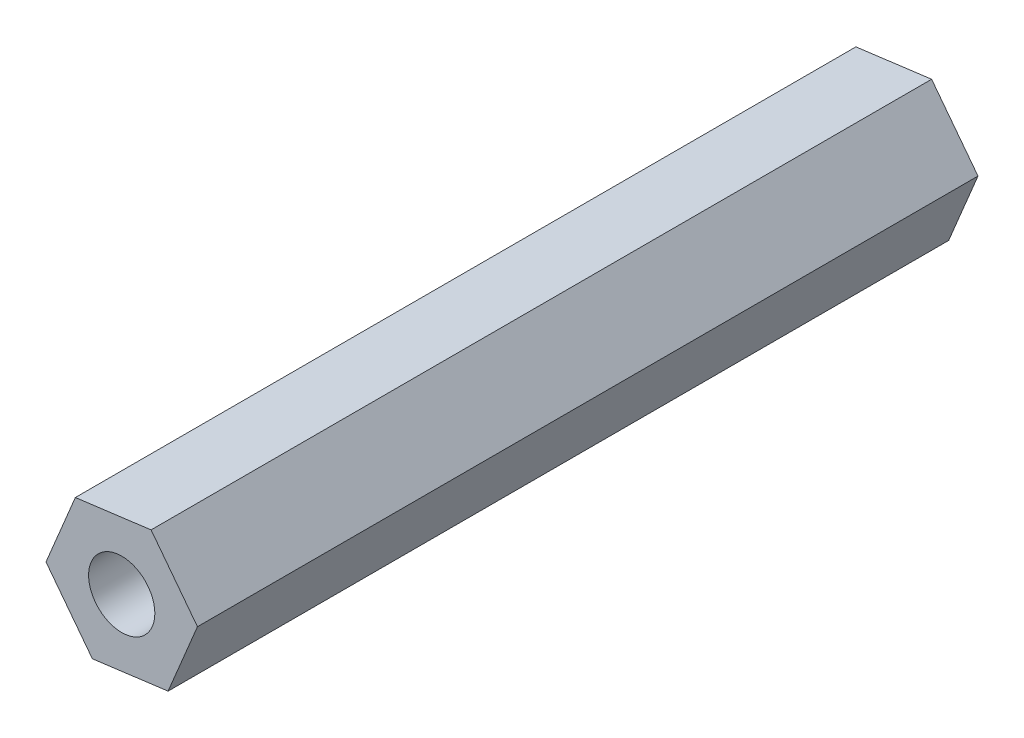
ISO-10303-21;
HEADER;
FILE_DESCRIPTION(('STEP AP214'),'2;1');
FILE_NAME('part.step','',(''),(''),'','','');
FILE_SCHEMA(('AUTOMOTIVE_DESIGN { 1 0 10303 214 1 1 1 1 }'));
ENDSEC;
DATA;
#1=APPLICATION_CONTEXT('core data for automotive mechanical design processes');
#2=APPLICATION_PROTOCOL_DEFINITION('international standard','automotive_design',2000,#1);
#3=PRODUCT_CONTEXT('',#1,'mechanical');
#4=PRODUCT('Part','Part','',(#3));
#5=PRODUCT_RELATED_PRODUCT_CATEGORY('part','',(#4));
#6=PRODUCT_DEFINITION_FORMATION('','',#4);
#7=PRODUCT_DEFINITION_CONTEXT('part definition',#1,'design');
#8=PRODUCT_DEFINITION('design','',#6,#7);
#9=PRODUCT_DEFINITION_SHAPE('','',#8);
#10=(LENGTH_UNIT() NAMED_UNIT(*) SI_UNIT(.MILLI.,.METRE.));
#11=(NAMED_UNIT(*) PLANE_ANGLE_UNIT() SI_UNIT($,.RADIAN.));
#12=(NAMED_UNIT(*) SI_UNIT($,.STERADIAN.) SOLID_ANGLE_UNIT());
#13=UNCERTAINTY_MEASURE_WITH_UNIT(LENGTH_MEASURE(1.E-05),#10,'distance_accuracy_value','');
#14=(GEOMETRIC_REPRESENTATION_CONTEXT(3) GLOBAL_UNCERTAINTY_ASSIGNED_CONTEXT((#13)) GLOBAL_UNIT_ASSIGNED_CONTEXT((#10,
#11,#12)) REPRESENTATION_CONTEXT('',''));
#15=CARTESIAN_POINT('',(0.,0.,0.));
#16=DIRECTION('',(0.,0.,1.));
#17=DIRECTION('',(1.,0.,0.));
#18=AXIS2_PLACEMENT_3D('',#15,#16,#17);
#19=CARTESIAN_POINT('',(0.,0.,74.95));
#20=DIRECTION('',(0.,0.,1.));
#21=DIRECTION('',(1.,0.,0.));
#22=AXIS2_PLACEMENT_3D('',#19,#20,#21);
#23=PLANE('',#22);
#24=DIRECTION('',(0.384520198768807,0.923116578086862,0.));
#25=VECTOR('',#24,1.);
#26=CARTESIAN_POINT('',(4.45207223514963,-5.8260094529912,74.95));
#27=LINE('',#26,#25);
#28=CARTESIAN_POINT('',(4.45207223514963,-5.8260094529912,74.95));
#29=VERTEX_POINT('',#28);
#30=CARTESIAN_POINT('',(7.27150830655346,0.942602928627349,74.95));
#31=VERTEX_POINT('',#30);
#32=EDGE_CURVE('E128',#29,#31,#27,.T.);
#33=ORIENTED_EDGE('',*,*,#32,.T.);
#34=DIRECTION('',(-0.607182307893379,0.79456254944546,0.));
#35=VECTOR('',#34,1.);
#36=CARTESIAN_POINT('',(7.27150830655346,0.942602928627349,74.95));
#37=LINE('',#36,#35);
#38=CARTESIAN_POINT('',(2.81943607140384,6.76861238161854,74.95));
#39=VERTEX_POINT('',#38);
#40=EDGE_CURVE('E86',#31,#39,#37,.T.);
#41=ORIENTED_EDGE('',*,*,#40,.T.);
#42=DIRECTION('',(-0.991702506662188,-0.1285540286414,0.));
#43=VECTOR('',#42,1.);
#44=CARTESIAN_POINT('',(2.81943607140384,6.76861238161854,74.95));
#45=LINE('',#44,#43);
#46=CARTESIAN_POINT('',(-4.45207223514962,5.8260094529912,74.95));
#47=VERTEX_POINT('',#46);
#48=EDGE_CURVE('E99',#39,#47,#45,.T.);
#49=ORIENTED_EDGE('',*,*,#48,.T.);
#50=DIRECTION('',(-0.384520198768808,-0.923116578086861,0.));
#51=VECTOR('',#50,1.);
#52=CARTESIAN_POINT('',(-4.45207223514962,5.8260094529912,74.95));
#53=LINE('',#52,#51);
#54=CARTESIAN_POINT('',(-7.27150830655346,-0.942602928627337,74.95));
#55=VERTEX_POINT('',#54);
#56=EDGE_CURVE('E93',#47,#55,#53,.T.);
#57=ORIENTED_EDGE('',*,*,#56,.T.);
#58=DIRECTION('',(0.607182307893379,-0.79456254944546,0.));
#59=VECTOR('',#58,1.);
#60=CARTESIAN_POINT('',(-7.27150830655346,-0.942602928627337,74.95));
#61=LINE('',#60,#59);
#62=CARTESIAN_POINT('',(-2.81943607140382,-6.76861238161854,74.95));
#63=VERTEX_POINT('',#62);
#64=EDGE_CURVE('E97',#55,#63,#61,.T.);
#65=ORIENTED_EDGE('',*,*,#64,.T.);
#66=DIRECTION('',(0.991702506662188,0.1285540286414,0.));
#67=VECTOR('',#66,1.);
#68=CARTESIAN_POINT('',(-2.81943607140382,-6.76861238161854,74.95));
#69=LINE('',#68,#67);
#70=EDGE_CURVE('E49',#63,#29,#69,.T.);
#71=ORIENTED_EDGE('',*,*,#70,.T.);
#72=EDGE_LOOP('',(#33,#41,#49,#57,#65,#71));
#73=FACE_BOUND('',#72,.T.);
#74=CARTESIAN_POINT('',(0.,0.,74.95));
#75=DIRECTION('',(0.,0.,1.));
#76=DIRECTION('',(1.,0.,0.));
#77=AXIS2_PLACEMENT_3D('',#74,#75,#76);
#78=CIRCLE('',#77,3.18);
#79=CARTESIAN_POINT('',(3.18,0.,74.95));
#80=VERTEX_POINT('',#79);
#81=EDGE_CURVE('E121',#80,#80,#78,.T.);
#82=ORIENTED_EDGE('',*,*,#81,.F.);
#83=EDGE_LOOP('',(#82));
#84=FACE_BOUND('',#83,.T.);
#85=ADVANCED_FACE('F32',(#73,#84),#23,.T.);
#86=CARTESIAN_POINT('',(0.,0.,0.));
#87=DIRECTION('',(0.,0.,1.));
#88=DIRECTION('',(1.,0.,0.));
#89=AXIS2_PLACEMENT_3D('',#86,#87,#88);
#90=PLANE('',#89);
#91=DIRECTION('',(0.384520198768807,0.923116578086862,0.));
#92=VECTOR('',#91,1.);
#93=CARTESIAN_POINT('',(4.45207223514963,-5.8260094529912,0.));
#94=LINE('',#93,#92);
#95=CARTESIAN_POINT('',(4.45207223514963,-5.8260094529912,0.));
#96=VERTEX_POINT('',#95);
#97=CARTESIAN_POINT('',(7.27150830655346,0.942602928627349,0.));
#98=VERTEX_POINT('',#97);
#99=EDGE_CURVE('E117',#96,#98,#94,.T.);
#100=ORIENTED_EDGE('',*,*,#99,.F.);
#101=DIRECTION('',(0.991702506662188,0.1285540286414,0.));
#102=VECTOR('',#101,1.);
#103=CARTESIAN_POINT('',(-2.81943607140382,-6.76861238161854,0.));
#104=LINE('',#103,#102);
#105=CARTESIAN_POINT('',(-2.81943607140382,-6.76861238161854,0.));
#106=VERTEX_POINT('',#105);
#107=EDGE_CURVE('E78',#106,#96,#104,.T.);
#108=ORIENTED_EDGE('',*,*,#107,.F.);
#109=DIRECTION('',(0.607182307893379,-0.79456254944546,0.));
#110=VECTOR('',#109,1.);
#111=CARTESIAN_POINT('',(-7.27150830655346,-0.942602928627337,0.));
#112=LINE('',#111,#110);
#113=CARTESIAN_POINT('',(-7.27150830655346,-0.942602928627337,0.));
#114=VERTEX_POINT('',#113);
#115=EDGE_CURVE('E72',#114,#106,#112,.T.);
#116=ORIENTED_EDGE('',*,*,#115,.F.);
#117=DIRECTION('',(-0.384520198768808,-0.923116578086861,0.));
#118=VECTOR('',#117,1.);
#119=CARTESIAN_POINT('',(-4.45207223514962,5.8260094529912,0.));
#120=LINE('',#119,#118);
#121=CARTESIAN_POINT('',(-4.45207223514962,5.8260094529912,0.));
#122=VERTEX_POINT('',#121);
#123=EDGE_CURVE('E107',#122,#114,#120,.T.);
#124=ORIENTED_EDGE('',*,*,#123,.F.);
#125=DIRECTION('',(-0.991702506662188,-0.1285540286414,0.));
#126=VECTOR('',#125,1.);
#127=CARTESIAN_POINT('',(2.81943607140384,6.76861238161854,0.));
#128=LINE('',#127,#126);
#129=CARTESIAN_POINT('',(2.81943607140384,6.76861238161854,0.));
#130=VERTEX_POINT('',#129);
#131=EDGE_CURVE('E123',#130,#122,#128,.T.);
#132=ORIENTED_EDGE('',*,*,#131,.F.);
#133=DIRECTION('',(-0.607182307893379,0.79456254944546,0.));
#134=VECTOR('',#133,1.);
#135=CARTESIAN_POINT('',(7.27150830655346,0.942602928627349,0.));
#136=LINE('',#135,#134);
#137=EDGE_CURVE('E120',#98,#130,#136,.T.);
#138=ORIENTED_EDGE('',*,*,#137,.F.);
#139=EDGE_LOOP('',(#100,#108,#116,#124,#132,#138));
#140=FACE_BOUND('',#139,.T.);
#141=CARTESIAN_POINT('',(0.,0.,0.));
#142=DIRECTION('',(0.,0.,1.));
#143=DIRECTION('',(1.,0.,0.));
#144=AXIS2_PLACEMENT_3D('',#141,#142,#143);
#145=CIRCLE('',#144,3.18);
#146=CARTESIAN_POINT('',(3.18,0.,0.));
#147=VERTEX_POINT('',#146);
#148=EDGE_CURVE('E221',#147,#147,#145,.T.);
#149=ORIENTED_EDGE('',*,*,#148,.T.);
#150=EDGE_LOOP('',(#149));
#151=FACE_BOUND('',#150,.T.);
#152=ADVANCED_FACE('F137',(#140,#151),#90,.F.);
#153=CARTESIAN_POINT('',(4.45207223514963,-5.8260094529912,74.95));
#154=DIRECTION('',(-0.923116578086862,0.384520198768807,0.));
#155=DIRECTION('',(-0.384520198768807,-0.923116578086862,0.));
#156=AXIS2_PLACEMENT_3D('',#153,#154,#155);
#157=PLANE('',#156);
#158=ORIENTED_EDGE('',*,*,#99,.T.);
#159=DIRECTION('',(0.,0.,-1.));
#160=VECTOR('',#159,1.);
#161=CARTESIAN_POINT('',(7.27150830655346,0.942602928627349,74.95));
#162=LINE('',#161,#160);
#163=EDGE_CURVE('E11',#31,#98,#162,.T.);
#164=ORIENTED_EDGE('',*,*,#163,.F.);
#165=ORIENTED_EDGE('',*,*,#32,.F.);
#166=DIRECTION('',(0.,0.,-1.));
#167=VECTOR('',#166,1.);
#168=CARTESIAN_POINT('',(4.45207223514963,-5.8260094529912,74.95));
#169=LINE('',#168,#167);
#170=EDGE_CURVE('E113',#29,#96,#169,.T.);
#171=ORIENTED_EDGE('',*,*,#170,.T.);
#172=EDGE_LOOP('',(#158,#164,#165,#171));
#173=FACE_BOUND('',#172,.T.);
#174=ADVANCED_FACE('F34',(#173),#157,.F.);
#175=CARTESIAN_POINT('',(7.27150830655346,0.942602928627349,74.95));
#176=DIRECTION('',(-0.79456254944546,-0.607182307893379,0.));
#177=DIRECTION('',(0.607182307893379,-0.79456254944546,0.));
#178=AXIS2_PLACEMENT_3D('',#175,#176,#177);
#179=PLANE('',#178);
#180=ORIENTED_EDGE('',*,*,#137,.T.);
#181=DIRECTION('',(0.,0.,-1.));
#182=VECTOR('',#181,1.);
#183=CARTESIAN_POINT('',(2.81943607140384,6.76861238161854,74.95));
#184=LINE('',#183,#182);
#185=EDGE_CURVE('E41',#39,#130,#184,.T.);
#186=ORIENTED_EDGE('',*,*,#185,.F.);
#187=ORIENTED_EDGE('',*,*,#40,.F.);
#188=ORIENTED_EDGE('',*,*,#163,.T.);
#189=EDGE_LOOP('',(#180,#186,#187,#188));
#190=FACE_BOUND('',#189,.T.);
#191=ADVANCED_FACE('F162',(#190),#179,.F.);
#192=CARTESIAN_POINT('',(2.81943607140384,6.76861238161854,74.95));
#193=DIRECTION('',(0.1285540286414,-0.991702506662188,0.));
#194=DIRECTION('',(0.991702506662188,0.1285540286414,0.));
#195=AXIS2_PLACEMENT_3D('',#192,#193,#194);
#196=PLANE('',#195);
#197=ORIENTED_EDGE('',*,*,#131,.T.);
#198=DIRECTION('',(0.,0.,-1.));
#199=VECTOR('',#198,1.);
#200=CARTESIAN_POINT('',(-4.45207223514962,5.8260094529912,74.95));
#201=LINE('',#200,#199);
#202=EDGE_CURVE('E108',#47,#122,#201,.T.);
#203=ORIENTED_EDGE('',*,*,#202,.F.);
#204=ORIENTED_EDGE('',*,*,#48,.F.);
#205=ORIENTED_EDGE('',*,*,#185,.T.);
#206=EDGE_LOOP('',(#197,#203,#204,#205));
#207=FACE_BOUND('',#206,.T.);
#208=ADVANCED_FACE('F134',(#207),#196,.F.);
#209=CARTESIAN_POINT('',(-4.45207223514962,5.8260094529912,74.95));
#210=DIRECTION('',(0.923116578086861,-0.384520198768808,0.));
#211=DIRECTION('',(0.384520198768808,0.923116578086861,0.));
#212=AXIS2_PLACEMENT_3D('',#209,#210,#211);
#213=PLANE('',#212);
#214=ORIENTED_EDGE('',*,*,#123,.T.);
#215=DIRECTION('',(0.,0.,-1.));
#216=VECTOR('',#215,1.);
#217=CARTESIAN_POINT('',(-7.27150830655346,-0.942602928627337,74.95));
#218=LINE('',#217,#216);
#219=EDGE_CURVE('E104',#55,#114,#218,.T.);
#220=ORIENTED_EDGE('',*,*,#219,.F.);
#221=ORIENTED_EDGE('',*,*,#56,.F.);
#222=ORIENTED_EDGE('',*,*,#202,.T.);
#223=EDGE_LOOP('',(#214,#220,#221,#222));
#224=FACE_BOUND('',#223,.T.);
#225=ADVANCED_FACE('F105',(#224),#213,.F.);
#226=CARTESIAN_POINT('',(-7.27150830655346,-0.942602928627337,74.95));
#227=DIRECTION('',(0.79456254944546,0.607182307893379,0.));
#228=DIRECTION('',(-0.607182307893379,0.794562549445461,0.));
#229=AXIS2_PLACEMENT_3D('',#226,#227,#228);
#230=PLANE('',#229);
#231=ORIENTED_EDGE('',*,*,#115,.T.);
#232=DIRECTION('',(0.,0.,-1.));
#233=VECTOR('',#232,1.);
#234=CARTESIAN_POINT('',(-2.81943607140382,-6.76861238161854,74.95));
#235=LINE('',#234,#233);
#236=EDGE_CURVE('E109',#63,#106,#235,.T.);
#237=ORIENTED_EDGE('',*,*,#236,.F.);
#238=ORIENTED_EDGE('',*,*,#64,.F.);
#239=ORIENTED_EDGE('',*,*,#219,.T.);
#240=EDGE_LOOP('',(#231,#237,#238,#239));
#241=FACE_BOUND('',#240,.T.);
#242=ADVANCED_FACE('F111',(#241),#230,.F.);
#243=CARTESIAN_POINT('',(-2.81943607140382,-6.76861238161854,74.95));
#244=DIRECTION('',(-0.1285540286414,0.991702506662188,0.));
#245=DIRECTION('',(-0.991702506662188,-0.1285540286414,0.));
#246=AXIS2_PLACEMENT_3D('',#243,#244,#245);
#247=PLANE('',#246);
#248=ORIENTED_EDGE('',*,*,#107,.T.);
#249=ORIENTED_EDGE('',*,*,#170,.F.);
#250=ORIENTED_EDGE('',*,*,#70,.F.);
#251=ORIENTED_EDGE('',*,*,#236,.T.);
#252=EDGE_LOOP('',(#248,#249,#250,#251));
#253=FACE_BOUND('',#252,.T.);
#254=ADVANCED_FACE('F142',(#253),#247,.F.);
#255=CARTESIAN_POINT('',(0.,0.,74.95));
#256=DIRECTION('',(0.,0.,-1.));
#257=DIRECTION('',(-1.,0.,0.));
#258=AXIS2_PLACEMENT_3D('',#255,#256,#257);
#259=CYLINDRICAL_SURFACE('',#258,3.18);
#260=ORIENTED_EDGE('',*,*,#81,.T.);
#261=EDGE_LOOP('',(#260));
#262=FACE_BOUND('',#261,.T.);
#263=ORIENTED_EDGE('',*,*,#148,.F.);
#264=EDGE_LOOP('',(#263));
#265=FACE_BOUND('',#264,.T.);
#266=ADVANCED_FACE('F144',(#262,#265),#259,.F.);
#267=CLOSED_SHELL('',(#85,#152,#174,#191,#208,#225,#242,#254,#266));
#268=MANIFOLD_SOLID_BREP('B2',#267);
#269=ADVANCED_BREP_SHAPE_REPRESENTATION('',(#18,#268),#14);
#270=SHAPE_DEFINITION_REPRESENTATION(#9,#269);
ENDSEC;
END-ISO-10303-21;
